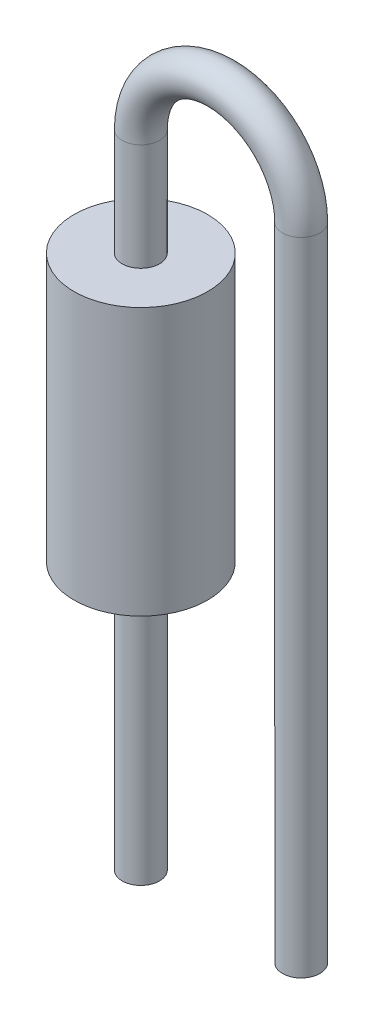
ISO-10303-21;
HEADER;
FILE_DESCRIPTION(('STEP AP214'),'2;1');
FILE_NAME('part.step','',(''),(''),'','','');
FILE_SCHEMA(('AUTOMOTIVE_DESIGN { 1 0 10303 214 1 1 1 1 }'));
ENDSEC;
DATA;
#1=APPLICATION_CONTEXT('core data for automotive mechanical design processes');
#2=APPLICATION_PROTOCOL_DEFINITION('international standard','automotive_design',2000,#1);
#3=PRODUCT_CONTEXT('',#1,'mechanical');
#4=PRODUCT('Part','Part','',(#3));
#5=PRODUCT_RELATED_PRODUCT_CATEGORY('part','',(#4));
#6=PRODUCT_DEFINITION_FORMATION('','',#4);
#7=PRODUCT_DEFINITION_CONTEXT('part definition',#1,'design');
#8=PRODUCT_DEFINITION('design','',#6,#7);
#9=PRODUCT_DEFINITION_SHAPE('','',#8);
#10=(LENGTH_UNIT() NAMED_UNIT(*) SI_UNIT(.MILLI.,.METRE.));
#11=(NAMED_UNIT(*) PLANE_ANGLE_UNIT() SI_UNIT($,.RADIAN.));
#12=(NAMED_UNIT(*) SI_UNIT($,.STERADIAN.) SOLID_ANGLE_UNIT());
#13=UNCERTAINTY_MEASURE_WITH_UNIT(LENGTH_MEASURE(1.E-05),#10,'distance_accuracy_value','');
#14=(GEOMETRIC_REPRESENTATION_CONTEXT(3) GLOBAL_UNCERTAINTY_ASSIGNED_CONTEXT((#13)) GLOBAL_UNIT_ASSIGNED_CONTEXT((#10,
#11,#12)) REPRESENTATION_CONTEXT('',''));
#15=CARTESIAN_POINT('',(0.,0.,0.));
#16=DIRECTION('',(0.,0.,1.));
#17=DIRECTION('',(1.,0.,0.));
#18=AXIS2_PLACEMENT_3D('',#15,#16,#17);
#19=CARTESIAN_POINT('',(0.,12.,0.));
#20=DIRECTION('',(0.,-1.,0.));
#21=DIRECTION('',(0.,0.,-1.));
#22=AXIS2_PLACEMENT_3D('',#19,#20,#21);
#23=CYLINDRICAL_SURFACE('',#22,0.35);
#24=CARTESIAN_POINT('',(0.,12.,0.));
#25=DIRECTION('',(0.,1.,0.));
#26=DIRECTION('',(0.,0.,1.));
#27=AXIS2_PLACEMENT_3D('',#24,#25,#26);
#28=CIRCLE('',#27,0.35);
#29=CARTESIAN_POINT('',(-0.35,12.,0.));
#30=VERTEX_POINT('',#29);
#31=EDGE_CURVE('E44',#30,#30,#28,.T.);
#32=ORIENTED_EDGE('',*,*,#31,.F.);
#33=EDGE_LOOP('',(#32));
#34=FACE_BOUND('',#33,.T.);
#35=CARTESIAN_POINT('',(0.,10.,0.));
#36=DIRECTION('',(0.,-1.,0.));
#37=DIRECTION('',(0.,0.,-1.));
#38=AXIS2_PLACEMENT_3D('',#35,#36,#37);
#39=CIRCLE('',#38,0.35);
#40=CARTESIAN_POINT('',(0.,10.,-0.35));
#41=VERTEX_POINT('',#40);
#42=EDGE_CURVE('E10',#41,#41,#39,.T.);
#43=ORIENTED_EDGE('',*,*,#42,.F.);
#44=EDGE_LOOP('',(#43));
#45=FACE_BOUND('',#44,.T.);
#46=ADVANCED_FACE('F28',(#34,#45),#23,.T.);
#47=CARTESIAN_POINT('',(3.,12.,0.));
#48=DIRECTION('',(0.,-1.,0.));
#49=DIRECTION('',(1.,0.,0.));
#50=AXIS2_PLACEMENT_3D('',#47,#48,#49);
#51=CYLINDRICAL_SURFACE('',#50,0.35);
#52=CARTESIAN_POINT('',(3.,12.,0.));
#53=DIRECTION('',(0.,-1.,0.));
#54=DIRECTION('',(0.,0.,1.));
#55=AXIS2_PLACEMENT_3D('',#52,#53,#54);
#56=CIRCLE('',#55,0.35);
#57=CARTESIAN_POINT('',(3.35,12.,0.));
#58=VERTEX_POINT('',#57);
#59=EDGE_CURVE('E39',#58,#58,#56,.T.);
#60=ORIENTED_EDGE('',*,*,#59,.T.);
#61=EDGE_LOOP('',(#60));
#62=FACE_BOUND('',#61,.T.);
#63=CARTESIAN_POINT('',(3.,0.,0.));
#64=DIRECTION('',(0.,-1.,0.));
#65=DIRECTION('',(0.,0.,1.));
#66=AXIS2_PLACEMENT_3D('',#63,#64,#65);
#67=CIRCLE('',#66,0.35);
#68=CARTESIAN_POINT('',(3.,0.,0.35));
#69=VERTEX_POINT('',#68);
#70=EDGE_CURVE('E35',#69,#69,#67,.T.);
#71=ORIENTED_EDGE('',*,*,#70,.F.);
#72=EDGE_LOOP('',(#71));
#73=FACE_BOUND('',#72,.T.);
#74=ADVANCED_FACE('F30',(#62,#73),#51,.T.);
#75=CARTESIAN_POINT('',(1.5,12.,0.));
#76=DIRECTION('',(0.,0.,-1.));
#77=DIRECTION('',(-1.,0.,0.));
#78=AXIS2_PLACEMENT_3D('',#75,#76,#77);
#79=TOROIDAL_SURFACE('',#78,1.5,0.35);
#80=CARTESIAN_POINT('',(1.5,12.,0.));
#81=DIRECTION('',(0.,0.,-1.));
#82=DIRECTION('',(-1.,0.,0.));
#83=AXIS2_PLACEMENT_3D('',#80,#81,#82);
#84=CIRCLE('',#83,1.85);
#85=EDGE_CURVE('',#30,#58,#84,.T.);
#86=ORIENTED_EDGE('',*,*,#31,.T.);
#87=ORIENTED_EDGE('',*,*,#59,.F.);
#88=ORIENTED_EDGE('',*,*,#85,.T.);
#89=ORIENTED_EDGE('',*,*,#85,.F.);
#90=EDGE_LOOP('',(#86,#88,#87,#89));
#91=FACE_BOUND('',#90,.T.);
#92=ADVANCED_FACE('F65',(#91),#79,.T.);
#93=CARTESIAN_POINT('',(3.,0.,0.));
#94=DIRECTION('',(0.,-1.,0.));
#95=DIRECTION('',(0.,0.,1.));
#96=AXIS2_PLACEMENT_3D('',#93,#94,#95);
#97=PLANE('',#96);
#98=ORIENTED_EDGE('',*,*,#70,.T.);
#99=EDGE_LOOP('',(#98));
#100=FACE_BOUND('',#99,.T.);
#101=ADVANCED_FACE('F92',(#100),#97,.T.);
#102=CARTESIAN_POINT('',(0.,10.,0.));
#103=DIRECTION('',(0.,-1.,0.));
#104=DIRECTION('',(0.,0.,-1.));
#105=AXIS2_PLACEMENT_3D('',#102,#103,#104);
#106=PLANE('',#105);
#107=CARTESIAN_POINT('',(0.,10.,0.));
#108=DIRECTION('',(0.,-1.,0.));
#109=DIRECTION('',(0.,0.,-1.));
#110=AXIS2_PLACEMENT_3D('',#107,#108,#109);
#111=CIRCLE('',#110,1.25);
#112=CARTESIAN_POINT('',(0.,10.,-1.25));
#113=VERTEX_POINT('',#112);
#114=EDGE_CURVE('E50',#113,#113,#111,.T.);
#115=ORIENTED_EDGE('',*,*,#114,.F.);
#116=EDGE_LOOP('',(#115));
#117=FACE_BOUND('',#116,.T.);
#118=ORIENTED_EDGE('',*,*,#42,.T.);
#119=EDGE_LOOP('',(#118));
#120=FACE_BOUND('',#119,.T.);
#121=ADVANCED_FACE('F94',(#117,#120),#106,.F.);
#122=CARTESIAN_POINT('',(0.,5.,0.));
#123=DIRECTION('',(0.,-1.,0.));
#124=DIRECTION('',(0.,0.,-1.));
#125=AXIS2_PLACEMENT_3D('',#122,#123,#124);
#126=PLANE('',#125);
#127=CARTESIAN_POINT('',(0.,5.,0.));
#128=DIRECTION('',(0.,-1.,0.));
#129=DIRECTION('',(0.,0.,-1.));
#130=AXIS2_PLACEMENT_3D('',#127,#128,#129);
#131=CIRCLE('',#130,1.25);
#132=CARTESIAN_POINT('',(0.,5.,-1.25));
#133=VERTEX_POINT('',#132);
#134=EDGE_CURVE('E55',#133,#133,#131,.T.);
#135=ORIENTED_EDGE('',*,*,#134,.T.);
#136=EDGE_LOOP('',(#135));
#137=FACE_BOUND('',#136,.T.);
#138=CARTESIAN_POINT('',(0.,5.,0.));
#139=DIRECTION('',(0.,-1.,0.));
#140=DIRECTION('',(0.,0.,-1.));
#141=AXIS2_PLACEMENT_3D('',#138,#139,#140);
#142=CIRCLE('',#141,0.35);
#143=CARTESIAN_POINT('',(0.,5.,-0.35));
#144=VERTEX_POINT('',#143);
#145=EDGE_CURVE('E47',#144,#144,#142,.T.);
#146=ORIENTED_EDGE('',*,*,#145,.F.);
#147=EDGE_LOOP('',(#146));
#148=FACE_BOUND('',#147,.T.);
#149=ADVANCED_FACE('F89',(#137,#148),#126,.T.);
#150=CARTESIAN_POINT('',(0.,10.,0.));
#151=DIRECTION('',(0.,-1.,0.));
#152=DIRECTION('',(0.,0.,-1.));
#153=AXIS2_PLACEMENT_3D('',#150,#151,#152);
#154=CYLINDRICAL_SURFACE('',#153,1.25);
#155=ORIENTED_EDGE('',*,*,#114,.T.);
#156=EDGE_LOOP('',(#155));
#157=FACE_BOUND('',#156,.T.);
#158=ORIENTED_EDGE('',*,*,#134,.F.);
#159=EDGE_LOOP('',(#158));
#160=FACE_BOUND('',#159,.T.);
#161=ADVANCED_FACE('F82',(#157,#160),#154,.T.);
#162=CARTESIAN_POINT('',(0.,0.,0.));
#163=DIRECTION('',(0.,1.,0.));
#164=DIRECTION('',(0.,0.,1.));
#165=AXIS2_PLACEMENT_3D('',#162,#163,#164);
#166=PLANE('',#165);
#167=CARTESIAN_POINT('',(0.,0.,0.));
#168=DIRECTION('',(0.,1.,0.));
#169=DIRECTION('',(0.,0.,1.));
#170=AXIS2_PLACEMENT_3D('',#167,#168,#169);
#171=CIRCLE('',#170,0.35);
#172=CARTESIAN_POINT('',(0.,0.,0.35));
#173=VERTEX_POINT('',#172);
#174=EDGE_CURVE('E49',#173,#173,#171,.T.);
#175=ORIENTED_EDGE('',*,*,#174,.F.);
#176=EDGE_LOOP('',(#175));
#177=FACE_BOUND('',#176,.T.);
#178=ADVANCED_FACE('F78',(#177),#166,.F.);
#179=ORIENTED_EDGE('',*,*,#145,.T.);
#180=EDGE_LOOP('',(#179));
#181=FACE_BOUND('',#180,.T.);
#182=ORIENTED_EDGE('',*,*,#174,.T.);
#183=EDGE_LOOP('',(#182));
#184=FACE_BOUND('',#183,.T.);
#185=ADVANCED_FACE('F71',(#181,#184),#23,.T.);
#186=CLOSED_SHELL('',(#46,#74,#92,#101,#121,#149,#161,#178,#185));
#187=MANIFOLD_SOLID_BREP('B2',#186);
#188=ADVANCED_BREP_SHAPE_REPRESENTATION('',(#18,#187),#14);
#189=SHAPE_DEFINITION_REPRESENTATION(#9,#188);
ENDSEC;
END-ISO-10303-21;
